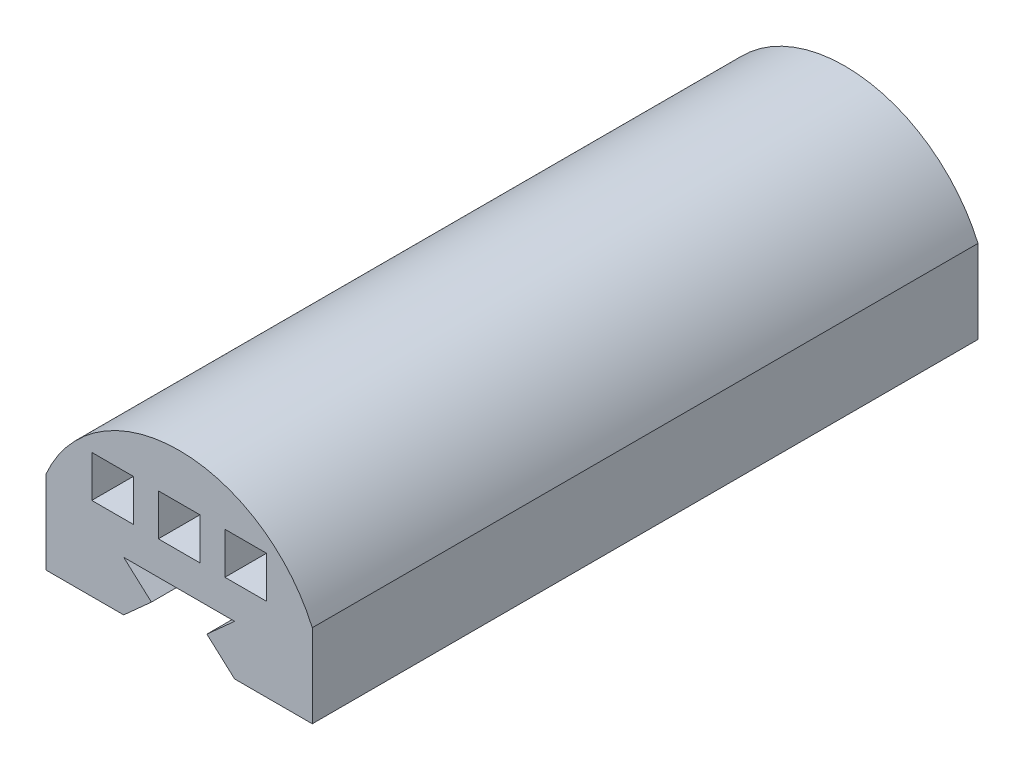
ISO-10303-21;
HEADER;
FILE_DESCRIPTION(('STEP AP214'),'2;1');
FILE_NAME('part.step','',(''),(''),'','','');
FILE_SCHEMA(('AUTOMOTIVE_DESIGN { 1 0 10303 214 1 1 1 1 }'));
ENDSEC;
DATA;
#1=APPLICATION_CONTEXT('core data for automotive mechanical design processes');
#2=APPLICATION_PROTOCOL_DEFINITION('international standard','automotive_design',2000,#1);
#3=PRODUCT_CONTEXT('',#1,'mechanical');
#4=PRODUCT('Part','Part','',(#3));
#5=PRODUCT_RELATED_PRODUCT_CATEGORY('part','',(#4));
#6=PRODUCT_DEFINITION_FORMATION('','',#4);
#7=PRODUCT_DEFINITION_CONTEXT('part definition',#1,'design');
#8=PRODUCT_DEFINITION('design','',#6,#7);
#9=PRODUCT_DEFINITION_SHAPE('','',#8);
#10=(LENGTH_UNIT() NAMED_UNIT(*) SI_UNIT(.MILLI.,.METRE.));
#11=(NAMED_UNIT(*) PLANE_ANGLE_UNIT() SI_UNIT($,.RADIAN.));
#12=(NAMED_UNIT(*) SI_UNIT($,.STERADIAN.) SOLID_ANGLE_UNIT());
#13=UNCERTAINTY_MEASURE_WITH_UNIT(LENGTH_MEASURE(1.E-05),#10,'distance_accuracy_value','');
#14=(GEOMETRIC_REPRESENTATION_CONTEXT(3) GLOBAL_UNCERTAINTY_ASSIGNED_CONTEXT((#13)) GLOBAL_UNIT_ASSIGNED_CONTEXT((#10,
#11,#12)) REPRESENTATION_CONTEXT('',''));
#15=CARTESIAN_POINT('',(0.,0.,0.));
#16=DIRECTION('',(0.,0.,1.));
#17=DIRECTION('',(1.,0.,0.));
#18=AXIS2_PLACEMENT_3D('',#15,#16,#17);
#19=CARTESIAN_POINT('',(-10.16,19.05,-25.4));
#20=DIRECTION('',(0.,0.,-1.));
#21=DIRECTION('',(-1.,0.,0.));
#22=AXIS2_PLACEMENT_3D('',#19,#20,#21);
#23=PLANE('',#22);
#24=DIRECTION('',(-1.,0.,0.));
#25=VECTOR('',#24,1.);
#26=CARTESIAN_POINT('',(-6.6675,9.525,-25.4));
#27=LINE('',#26,#25);
#28=CARTESIAN_POINT('',(-3.4925,9.525,-25.4));
#29=VERTEX_POINT('',#28);
#30=CARTESIAN_POINT('',(-6.6675,9.525,-25.4));
#31=VERTEX_POINT('',#30);
#32=EDGE_CURVE('E230',#29,#31,#27,.T.);
#33=ORIENTED_EDGE('',*,*,#32,.T.);
#34=DIRECTION('',(0.,-1.,0.));
#35=VECTOR('',#34,1.);
#36=CARTESIAN_POINT('',(-6.6675,9.525,-25.4));
#37=LINE('',#36,#35);
#38=CARTESIAN_POINT('',(-6.6675,6.35,-25.4));
#39=VERTEX_POINT('',#38);
#40=EDGE_CURVE('E250',#31,#39,#37,.T.);
#41=ORIENTED_EDGE('',*,*,#40,.T.);
#42=DIRECTION('',(1.,0.,0.));
#43=VECTOR('',#42,1.);
#44=CARTESIAN_POINT('',(-6.6675,6.35,-25.4));
#45=LINE('',#44,#43);
#46=CARTESIAN_POINT('',(-3.4925,6.35,-25.4));
#47=VERTEX_POINT('',#46);
#48=EDGE_CURVE('E246',#39,#47,#45,.T.);
#49=ORIENTED_EDGE('',*,*,#48,.T.);
#50=DIRECTION('',(0.,1.,0.));
#51=VECTOR('',#50,1.);
#52=CARTESIAN_POINT('',(-3.4925,9.525,-25.4));
#53=LINE('',#52,#51);
#54=EDGE_CURVE('E242',#47,#29,#53,.T.);
#55=ORIENTED_EDGE('',*,*,#54,.T.);
#56=EDGE_LOOP('',(#33,#41,#49,#55));
#57=FACE_BOUND('',#56,.T.);
#58=CARTESIAN_POINT('',(0.,1.905,-25.4));
#59=DIRECTION('',(0.,0.,-1.));
#60=DIRECTION('',(-1.,0.,0.));
#61=AXIS2_PLACEMENT_3D('',#58,#59,#60);
#62=CIRCLE('',#61,11.0897982398238);
#63=CARTESIAN_POINT('',(-10.16,6.35,-25.4));
#64=VERTEX_POINT('',#63);
#65=CARTESIAN_POINT('',(10.16,6.35,-25.4));
#66=VERTEX_POINT('',#65);
#67=EDGE_CURVE('E290',#64,#66,#62,.T.);
#68=ORIENTED_EDGE('',*,*,#67,.T.);
#69=DIRECTION('',(0.,-1.,0.));
#70=VECTOR('',#69,1.);
#71=CARTESIAN_POINT('',(10.16,19.05,-25.4));
#72=LINE('',#71,#70);
#73=CARTESIAN_POINT('',(10.16,0.,-25.4));
#74=VERTEX_POINT('',#73);
#75=EDGE_CURVE('E352',#66,#74,#72,.T.);
#76=ORIENTED_EDGE('',*,*,#75,.T.);
#77=DIRECTION('',(1.,0.,0.));
#78=VECTOR('',#77,1.);
#79=CARTESIAN_POINT('',(-10.16,0.,-25.4));
#80=LINE('',#79,#78);
#81=CARTESIAN_POINT('',(4.23333333333333,0.,-25.4));
#82=VERTEX_POINT('',#81);
#83=EDGE_CURVE('E339',#82,#74,#80,.T.);
#84=ORIENTED_EDGE('',*,*,#83,.F.);
#85=DIRECTION('',(-0.743294146247165,0.668964731622451,0.));
#86=VECTOR('',#85,1.);
#87=CARTESIAN_POINT('',(2.11666666666667,1.905,-25.4));
#88=LINE('',#87,#86);
#89=CARTESIAN_POINT('',(2.11666666666667,1.905,-25.4));
#90=VERTEX_POINT('',#89);
#91=EDGE_CURVE('E299',#82,#90,#88,.T.);
#92=ORIENTED_EDGE('',*,*,#91,.T.);
#93=DIRECTION('',(0.743294146247167,0.668964731622449,0.));
#94=VECTOR('',#93,1.);
#95=CARTESIAN_POINT('',(4.23333333333333,3.81,-25.4));
#96=LINE('',#95,#94);
#97=CARTESIAN_POINT('',(4.23333333333333,3.81,-25.4));
#98=VERTEX_POINT('',#97);
#99=EDGE_CURVE('E328',#90,#98,#96,.T.);
#100=ORIENTED_EDGE('',*,*,#99,.T.);
#101=DIRECTION('',(-1.,0.,0.));
#102=VECTOR('',#101,1.);
#103=CARTESIAN_POINT('',(-4.23333333333333,3.81,-25.4));
#104=LINE('',#103,#102);
#105=CARTESIAN_POINT('',(-4.23333333333333,3.81,-25.4));
#106=VERTEX_POINT('',#105);
#107=EDGE_CURVE('E324',#98,#106,#104,.T.);
#108=ORIENTED_EDGE('',*,*,#107,.T.);
#109=DIRECTION('',(0.743294146247166,-0.66896473162245,0.));
#110=VECTOR('',#109,1.);
#111=CARTESIAN_POINT('',(-2.11666666666667,1.905,-25.4));
#112=LINE('',#111,#110);
#113=CARTESIAN_POINT('',(-2.11666666666667,1.905,-25.4));
#114=VERTEX_POINT('',#113);
#115=EDGE_CURVE('E320',#106,#114,#112,.T.);
#116=ORIENTED_EDGE('',*,*,#115,.T.);
#117=DIRECTION('',(-0.743294146247166,-0.66896473162245,0.));
#118=VECTOR('',#117,1.);
#119=CARTESIAN_POINT('',(-4.23333333333333,0.,-25.4));
#120=LINE('',#119,#118);
#121=CARTESIAN_POINT('',(-4.23333333333333,0.,-25.4));
#122=VERTEX_POINT('',#121);
#123=EDGE_CURVE('E315',#114,#122,#120,.T.);
#124=ORIENTED_EDGE('',*,*,#123,.T.);
#125=CARTESIAN_POINT('',(-10.16,0.,-25.4));
#126=VERTEX_POINT('',#125);
#127=EDGE_CURVE('E340',#126,#122,#80,.T.);
#128=ORIENTED_EDGE('',*,*,#127,.F.);
#129=DIRECTION('',(0.,-1.,0.));
#130=VECTOR('',#129,1.);
#131=CARTESIAN_POINT('',(-10.16,19.05,-25.4));
#132=LINE('',#131,#130);
#133=EDGE_CURVE('E11',#64,#126,#132,.T.);
#134=ORIENTED_EDGE('',*,*,#133,.F.);
#135=EDGE_LOOP('',(#68,#76,#84,#92,#100,#108,#116,#124,#128,#134));
#136=FACE_BOUND('',#135,.T.);
#137=DIRECTION('',(-1.,0.,0.));
#138=VECTOR('',#137,1.);
#139=CARTESIAN_POINT('',(-1.5875,9.525,-25.4));
#140=LINE('',#139,#138);
#141=CARTESIAN_POINT('',(1.5875,9.525,-25.4));
#142=VERTEX_POINT('',#141);
#143=CARTESIAN_POINT('',(-1.5875,9.525,-25.4));
#144=VERTEX_POINT('',#143);
#145=EDGE_CURVE('E202',#142,#144,#140,.T.);
#146=ORIENTED_EDGE('',*,*,#145,.T.);
#147=DIRECTION('',(0.,-1.,0.));
#148=VECTOR('',#147,1.);
#149=CARTESIAN_POINT('',(-1.5875,9.525,-25.4));
#150=LINE('',#149,#148);
#151=CARTESIAN_POINT('',(-1.5875,6.35,-25.4));
#152=VERTEX_POINT('',#151);
#153=EDGE_CURVE('E188',#144,#152,#150,.T.);
#154=ORIENTED_EDGE('',*,*,#153,.T.);
#155=DIRECTION('',(1.,0.,0.));
#156=VECTOR('',#155,1.);
#157=CARTESIAN_POINT('',(-1.5875,6.35,-25.4));
#158=LINE('',#157,#156);
#159=CARTESIAN_POINT('',(1.5875,6.35,-25.4));
#160=VERTEX_POINT('',#159);
#161=EDGE_CURVE('E221',#152,#160,#158,.T.);
#162=ORIENTED_EDGE('',*,*,#161,.T.);
#163=DIRECTION('',(0.,1.,0.));
#164=VECTOR('',#163,1.);
#165=CARTESIAN_POINT('',(1.5875,9.525,-25.4));
#166=LINE('',#165,#164);
#167=EDGE_CURVE('E209',#160,#142,#166,.T.);
#168=ORIENTED_EDGE('',*,*,#167,.T.);
#169=EDGE_LOOP('',(#146,#154,#162,#168));
#170=FACE_BOUND('',#169,.T.);
#171=DIRECTION('',(-1.,0.,0.));
#172=VECTOR('',#171,1.);
#173=CARTESIAN_POINT('',(3.4925,9.525,-25.4));
#174=LINE('',#173,#172);
#175=CARTESIAN_POINT('',(6.6675,9.525,-25.4));
#176=VERTEX_POINT('',#175);
#177=CARTESIAN_POINT('',(3.4925,9.525,-25.4));
#178=VERTEX_POINT('',#177);
#179=EDGE_CURVE('E260',#176,#178,#174,.T.);
#180=ORIENTED_EDGE('',*,*,#179,.T.);
#181=DIRECTION('',(0.,-1.,0.));
#182=VECTOR('',#181,1.);
#183=CARTESIAN_POINT('',(3.4925,9.525,-25.4));
#184=LINE('',#183,#182);
#185=CARTESIAN_POINT('',(3.4925,6.35,-25.4));
#186=VERTEX_POINT('',#185);
#187=EDGE_CURVE('E280',#178,#186,#184,.T.);
#188=ORIENTED_EDGE('',*,*,#187,.T.);
#189=DIRECTION('',(1.,0.,0.));
#190=VECTOR('',#189,1.);
#191=CARTESIAN_POINT('',(3.4925,6.35,-25.4));
#192=LINE('',#191,#190);
#193=CARTESIAN_POINT('',(6.6675,6.35,-25.4));
#194=VERTEX_POINT('',#193);
#195=EDGE_CURVE('E276',#186,#194,#192,.T.);
#196=ORIENTED_EDGE('',*,*,#195,.T.);
#197=DIRECTION('',(0.,1.,0.));
#198=VECTOR('',#197,1.);
#199=CARTESIAN_POINT('',(6.6675,9.525,-25.4));
#200=LINE('',#199,#198);
#201=EDGE_CURVE('E272',#194,#176,#200,.T.);
#202=ORIENTED_EDGE('',*,*,#201,.T.);
#203=EDGE_LOOP('',(#180,#188,#196,#202));
#204=FACE_BOUND('',#203,.T.);
#205=ADVANCED_FACE('F39',(#57,#136,#170,#204),#23,.T.);
#206=CARTESIAN_POINT('',(-10.16,19.05,25.4));
#207=DIRECTION('',(0.,0.,-1.));
#208=DIRECTION('',(-1.,0.,0.));
#209=AXIS2_PLACEMENT_3D('',#206,#207,#208);
#210=PLANE('',#209);
#211=DIRECTION('',(0.,-1.,0.));
#212=VECTOR('',#211,1.);
#213=CARTESIAN_POINT('',(10.16,19.05,25.4));
#214=LINE('',#213,#212);
#215=CARTESIAN_POINT('',(10.16,6.35000000000003,25.4));
#216=VERTEX_POINT('',#215);
#217=CARTESIAN_POINT('',(10.16,0.,25.4));
#218=VERTEX_POINT('',#217);
#219=EDGE_CURVE('E355',#216,#218,#214,.T.);
#220=ORIENTED_EDGE('',*,*,#219,.F.);
#221=CARTESIAN_POINT('',(0.,1.905,25.4));
#222=DIRECTION('',(0.,0.,-1.));
#223=DIRECTION('',(-1.,0.,0.));
#224=AXIS2_PLACEMENT_3D('',#221,#222,#223);
#225=CIRCLE('',#224,11.0897982398238);
#226=CARTESIAN_POINT('',(-10.16,6.35,25.4));
#227=VERTEX_POINT('',#226);
#228=EDGE_CURVE('E227',#227,#216,#225,.T.);
#229=ORIENTED_EDGE('',*,*,#228,.F.);
#230=DIRECTION('',(0.,-1.,0.));
#231=VECTOR('',#230,1.);
#232=CARTESIAN_POINT('',(-10.16,19.05,25.4));
#233=LINE('',#232,#231);
#234=CARTESIAN_POINT('',(-10.16,0.,25.4));
#235=VERTEX_POINT('',#234);
#236=EDGE_CURVE('E47',#227,#235,#233,.T.);
#237=ORIENTED_EDGE('',*,*,#236,.T.);
#238=DIRECTION('',(1.,0.,0.));
#239=VECTOR('',#238,1.);
#240=CARTESIAN_POINT('',(-10.16,0.,25.4));
#241=LINE('',#240,#239);
#242=CARTESIAN_POINT('',(-4.23333333333333,0.,25.4));
#243=VERTEX_POINT('',#242);
#244=EDGE_CURVE('E347',#235,#243,#241,.T.);
#245=ORIENTED_EDGE('',*,*,#244,.T.);
#246=DIRECTION('',(-0.743294146247166,-0.66896473162245,0.));
#247=VECTOR('',#246,1.);
#248=CARTESIAN_POINT('',(-4.23333333333333,0.,25.4));
#249=LINE('',#248,#247);
#250=CARTESIAN_POINT('',(-2.11666666666667,1.905,25.4));
#251=VERTEX_POINT('',#250);
#252=EDGE_CURVE('E297',#251,#243,#249,.T.);
#253=ORIENTED_EDGE('',*,*,#252,.F.);
#254=DIRECTION('',(0.743294146247166,-0.66896473162245,0.));
#255=VECTOR('',#254,1.);
#256=CARTESIAN_POINT('',(-2.11666666666667,1.905,25.4));
#257=LINE('',#256,#255);
#258=CARTESIAN_POINT('',(-4.23333333333333,3.81,25.4));
#259=VERTEX_POINT('',#258);
#260=EDGE_CURVE('E300',#259,#251,#257,.T.);
#261=ORIENTED_EDGE('',*,*,#260,.F.);
#262=DIRECTION('',(-1.,0.,0.));
#263=VECTOR('',#262,1.);
#264=CARTESIAN_POINT('',(-4.23333333333333,3.81,25.4));
#265=LINE('',#264,#263);
#266=CARTESIAN_POINT('',(4.23333333333333,3.81,25.4));
#267=VERTEX_POINT('',#266);
#268=EDGE_CURVE('E303',#267,#259,#265,.T.);
#269=ORIENTED_EDGE('',*,*,#268,.F.);
#270=DIRECTION('',(0.743294146247167,0.668964731622449,0.));
#271=VECTOR('',#270,1.);
#272=CARTESIAN_POINT('',(4.23333333333333,3.81,25.4));
#273=LINE('',#272,#271);
#274=CARTESIAN_POINT('',(2.11666666666667,1.905,25.4));
#275=VERTEX_POINT('',#274);
#276=EDGE_CURVE('E306',#275,#267,#273,.T.);
#277=ORIENTED_EDGE('',*,*,#276,.F.);
#278=DIRECTION('',(-0.743294146247165,0.668964731622451,0.));
#279=VECTOR('',#278,1.);
#280=CARTESIAN_POINT('',(2.11666666666667,1.905,25.4));
#281=LINE('',#280,#279);
#282=CARTESIAN_POINT('',(4.23333333333333,0.,25.4));
#283=VERTEX_POINT('',#282);
#284=EDGE_CURVE('E309',#283,#275,#281,.T.);
#285=ORIENTED_EDGE('',*,*,#284,.F.);
#286=EDGE_CURVE('E346',#283,#218,#241,.T.);
#287=ORIENTED_EDGE('',*,*,#286,.T.);
#288=EDGE_LOOP('',(#220,#229,#237,#245,#253,#261,#269,#277,#285,#287));
#289=FACE_BOUND('',#288,.T.);
#290=DIRECTION('',(0.,-1.,0.));
#291=VECTOR('',#290,1.);
#292=CARTESIAN_POINT('',(-1.5875,9.525,25.4));
#293=LINE('',#292,#291);
#294=CARTESIAN_POINT('',(-1.5875,9.525,25.4));
#295=VERTEX_POINT('',#294);
#296=CARTESIAN_POINT('',(-1.5875,6.35,25.4));
#297=VERTEX_POINT('',#296);
#298=EDGE_CURVE('E212',#295,#297,#293,.T.);
#299=ORIENTED_EDGE('',*,*,#298,.F.);
#300=DIRECTION('',(-1.,0.,0.));
#301=VECTOR('',#300,1.);
#302=CARTESIAN_POINT('',(-1.5875,9.525,25.4));
#303=LINE('',#302,#301);
#304=CARTESIAN_POINT('',(1.5875,9.525,25.4));
#305=VERTEX_POINT('',#304);
#306=EDGE_CURVE('E205',#305,#295,#303,.T.);
#307=ORIENTED_EDGE('',*,*,#306,.F.);
#308=DIRECTION('',(0.,1.,0.));
#309=VECTOR('',#308,1.);
#310=CARTESIAN_POINT('',(1.5875,9.525,25.4));
#311=LINE('',#310,#309);
#312=CARTESIAN_POINT('',(1.5875,6.35,25.4));
#313=VERTEX_POINT('',#312);
#314=EDGE_CURVE('E216',#313,#305,#311,.T.);
#315=ORIENTED_EDGE('',*,*,#314,.F.);
#316=DIRECTION('',(1.,0.,0.));
#317=VECTOR('',#316,1.);
#318=CARTESIAN_POINT('',(-1.5875,6.35,25.4));
#319=LINE('',#318,#317);
#320=EDGE_CURVE('E210',#297,#313,#319,.T.);
#321=ORIENTED_EDGE('',*,*,#320,.F.);
#322=EDGE_LOOP('',(#299,#307,#315,#321));
#323=FACE_BOUND('',#322,.T.);
#324=DIRECTION('',(0.,-1.,0.));
#325=VECTOR('',#324,1.);
#326=CARTESIAN_POINT('',(-6.6675,9.525,25.4));
#327=LINE('',#326,#325);
#328=CARTESIAN_POINT('',(-6.6675,9.525,25.4));
#329=VERTEX_POINT('',#328);
#330=CARTESIAN_POINT('',(-6.6675,6.35,25.4));
#331=VERTEX_POINT('',#330);
#332=EDGE_CURVE('E231',#329,#331,#327,.T.);
#333=ORIENTED_EDGE('',*,*,#332,.F.);
#334=DIRECTION('',(-1.,0.,0.));
#335=VECTOR('',#334,1.);
#336=CARTESIAN_POINT('',(-6.6675,9.525,25.4));
#337=LINE('',#336,#335);
#338=CARTESIAN_POINT('',(-3.4925,9.525,25.4));
#339=VERTEX_POINT('',#338);
#340=EDGE_CURVE('E234',#339,#329,#337,.T.);
#341=ORIENTED_EDGE('',*,*,#340,.F.);
#342=DIRECTION('',(0.,1.,0.));
#343=VECTOR('',#342,1.);
#344=CARTESIAN_POINT('',(-3.4925,9.525,25.4));
#345=LINE('',#344,#343);
#346=CARTESIAN_POINT('',(-3.4925,6.35,25.4));
#347=VERTEX_POINT('',#346);
#348=EDGE_CURVE('E237',#347,#339,#345,.T.);
#349=ORIENTED_EDGE('',*,*,#348,.F.);
#350=DIRECTION('',(1.,0.,0.));
#351=VECTOR('',#350,1.);
#352=CARTESIAN_POINT('',(-6.6675,6.35,25.4));
#353=LINE('',#352,#351);
#354=EDGE_CURVE('E228',#331,#347,#353,.T.);
#355=ORIENTED_EDGE('',*,*,#354,.F.);
#356=EDGE_LOOP('',(#333,#341,#349,#355));
#357=FACE_BOUND('',#356,.T.);
#358=DIRECTION('',(0.,-1.,0.));
#359=VECTOR('',#358,1.);
#360=CARTESIAN_POINT('',(3.4925,9.525,25.4));
#361=LINE('',#360,#359);
#362=CARTESIAN_POINT('',(3.4925,9.525,25.4));
#363=VERTEX_POINT('',#362);
#364=CARTESIAN_POINT('',(3.4925,6.35,25.4));
#365=VERTEX_POINT('',#364);
#366=EDGE_CURVE('E261',#363,#365,#361,.T.);
#367=ORIENTED_EDGE('',*,*,#366,.F.);
#368=DIRECTION('',(-1.,0.,0.));
#369=VECTOR('',#368,1.);
#370=CARTESIAN_POINT('',(3.4925,9.525,25.4));
#371=LINE('',#370,#369);
#372=CARTESIAN_POINT('',(6.6675,9.525,25.4));
#373=VERTEX_POINT('',#372);
#374=EDGE_CURVE('E264',#373,#363,#371,.T.);
#375=ORIENTED_EDGE('',*,*,#374,.F.);
#376=DIRECTION('',(0.,1.,0.));
#377=VECTOR('',#376,1.);
#378=CARTESIAN_POINT('',(6.6675,9.525,25.4));
#379=LINE('',#378,#377);
#380=CARTESIAN_POINT('',(6.6675,6.35,25.4));
#381=VERTEX_POINT('',#380);
#382=EDGE_CURVE('E267',#381,#373,#379,.T.);
#383=ORIENTED_EDGE('',*,*,#382,.F.);
#384=DIRECTION('',(1.,0.,0.));
#385=VECTOR('',#384,1.);
#386=CARTESIAN_POINT('',(3.4925,6.35,25.4));
#387=LINE('',#386,#385);
#388=EDGE_CURVE('E258',#365,#381,#387,.T.);
#389=ORIENTED_EDGE('',*,*,#388,.F.);
#390=EDGE_LOOP('',(#367,#375,#383,#389));
#391=FACE_BOUND('',#390,.T.);
#392=ADVANCED_FACE('F373',(#289,#323,#357,#391),#210,.F.);
#393=CARTESIAN_POINT('',(0.,0.,0.));
#394=DIRECTION('',(0.,-1.,0.));
#395=DIRECTION('',(0.,0.,-1.));
#396=AXIS2_PLACEMENT_3D('',#393,#394,#395);
#397=PLANE('',#396);
#398=DIRECTION('',(0.,0.,1.));
#399=VECTOR('',#398,1.);
#400=CARTESIAN_POINT('',(4.23333333333333,0.,-34.6844248311053));
#401=LINE('',#400,#399);
#402=EDGE_CURVE('E333',#82,#283,#401,.T.);
#403=ORIENTED_EDGE('',*,*,#402,.F.);
#404=ORIENTED_EDGE('',*,*,#83,.T.);
#405=DIRECTION('',(0.,0.,1.));
#406=VECTOR('',#405,1.);
#407=CARTESIAN_POINT('',(10.16,0.,-25.4));
#408=LINE('',#407,#406);
#409=EDGE_CURVE('E343',#74,#218,#408,.T.);
#410=ORIENTED_EDGE('',*,*,#409,.T.);
#411=ORIENTED_EDGE('',*,*,#286,.F.);
#412=EDGE_LOOP('',(#403,#404,#410,#411));
#413=FACE_BOUND('',#412,.T.);
#414=ADVANCED_FACE('F365',(#413),#397,.T.);
#415=CARTESIAN_POINT('',(-10.16,19.05,-25.4));
#416=DIRECTION('',(1.,0.,0.));
#417=DIRECTION('',(0.,0.,-1.));
#418=AXIS2_PLACEMENT_3D('',#415,#416,#417);
#419=PLANE('',#418);
#420=ORIENTED_EDGE('',*,*,#236,.F.);
#421=DIRECTION('',(0.,0.,1.));
#422=VECTOR('',#421,1.);
#423=CARTESIAN_POINT('',(-10.16,6.35,-49.3623120754238));
#424=LINE('',#423,#422);
#425=EDGE_CURVE('E289',#64,#227,#424,.T.);
#426=ORIENTED_EDGE('',*,*,#425,.F.);
#427=ORIENTED_EDGE('',*,*,#133,.T.);
#428=DIRECTION('',(0.,0.,1.));
#429=VECTOR('',#428,1.);
#430=CARTESIAN_POINT('',(-10.16,0.,-25.4));
#431=LINE('',#430,#429);
#432=EDGE_CURVE('E350',#126,#235,#431,.T.);
#433=ORIENTED_EDGE('',*,*,#432,.T.);
#434=EDGE_LOOP('',(#420,#426,#427,#433));
#435=FACE_BOUND('',#434,.T.);
#436=ADVANCED_FACE('F399',(#435),#419,.F.);
#437=CARTESIAN_POINT('',(10.16,19.05,-25.4));
#438=DIRECTION('',(1.,0.,0.));
#439=DIRECTION('',(0.,0.,-1.));
#440=AXIS2_PLACEMENT_3D('',#437,#438,#439);
#441=PLANE('',#440);
#442=DIRECTION('',(0.,0.,1.));
#443=VECTOR('',#442,1.);
#444=CARTESIAN_POINT('',(10.16,6.35,-49.3623120754238));
#445=LINE('',#444,#443);
#446=EDGE_CURVE('E293',#66,#216,#445,.T.);
#447=ORIENTED_EDGE('',*,*,#446,.T.);
#448=ORIENTED_EDGE('',*,*,#219,.T.);
#449=ORIENTED_EDGE('',*,*,#409,.F.);
#450=ORIENTED_EDGE('',*,*,#75,.F.);
#451=EDGE_LOOP('',(#447,#448,#449,#450));
#452=FACE_BOUND('',#451,.T.);
#453=ADVANCED_FACE('F367',(#452),#441,.T.);
#454=DIRECTION('',(0.,0.,1.));
#455=VECTOR('',#454,1.);
#456=CARTESIAN_POINT('',(-4.23333333333333,0.,-34.6844248311053));
#457=LINE('',#456,#455);
#458=EDGE_CURVE('E318',#122,#243,#457,.T.);
#459=ORIENTED_EDGE('',*,*,#458,.T.);
#460=ORIENTED_EDGE('',*,*,#244,.F.);
#461=ORIENTED_EDGE('',*,*,#432,.F.);
#462=ORIENTED_EDGE('',*,*,#127,.T.);
#463=EDGE_LOOP('',(#459,#460,#461,#462));
#464=FACE_BOUND('',#463,.T.);
#465=ADVANCED_FACE('F395',(#464),#397,.T.);
#466=CARTESIAN_POINT('',(2.11666666666667,1.905,-34.6844248311053));
#467=DIRECTION('',(0.668964731622451,0.743294146247166,0.));
#468=DIRECTION('',(-0.743294146247166,0.668964731622451,0.));
#469=AXIS2_PLACEMENT_3D('',#466,#467,#468);
#470=PLANE('',#469);
#471=ORIENTED_EDGE('',*,*,#402,.T.);
#472=ORIENTED_EDGE('',*,*,#284,.T.);
#473=DIRECTION('',(0.,0.,1.));
#474=VECTOR('',#473,1.);
#475=CARTESIAN_POINT('',(2.11666666666667,1.905,-34.6844248311053));
#476=LINE('',#475,#474);
#477=EDGE_CURVE('E314',#90,#275,#476,.T.);
#478=ORIENTED_EDGE('',*,*,#477,.F.);
#479=ORIENTED_EDGE('',*,*,#91,.F.);
#480=EDGE_LOOP('',(#471,#472,#478,#479));
#481=FACE_BOUND('',#480,.T.);
#482=ADVANCED_FACE('F379',(#481),#470,.F.);
#483=CARTESIAN_POINT('',(4.23333333333333,3.81,-34.6844248311053));
#484=DIRECTION('',(0.668964731622449,-0.743294146247167,0.));
#485=DIRECTION('',(0.743294146247167,0.668964731622449,0.));
#486=AXIS2_PLACEMENT_3D('',#483,#484,#485);
#487=PLANE('',#486);
#488=ORIENTED_EDGE('',*,*,#477,.T.);
#489=ORIENTED_EDGE('',*,*,#276,.T.);
#490=DIRECTION('',(0.,0.,1.));
#491=VECTOR('',#490,1.);
#492=CARTESIAN_POINT('',(4.23333333333333,3.81,-34.6844248311053));
#493=LINE('',#492,#491);
#494=EDGE_CURVE('E327',#98,#267,#493,.T.);
#495=ORIENTED_EDGE('',*,*,#494,.F.);
#496=ORIENTED_EDGE('',*,*,#99,.F.);
#497=EDGE_LOOP('',(#488,#489,#495,#496));
#498=FACE_BOUND('',#497,.T.);
#499=ADVANCED_FACE('F382',(#498),#487,.F.);
#500=CARTESIAN_POINT('',(-4.23333333333333,3.81,-34.6844248311053));
#501=DIRECTION('',(0.,1.,0.));
#502=DIRECTION('',(0.,0.,1.));
#503=AXIS2_PLACEMENT_3D('',#500,#501,#502);
#504=PLANE('',#503);
#505=CARTESIAN_POINT('',(0.,3.81,4.10634179999999));
#506=DIRECTION('',(0.,1.,0.));
#507=DIRECTION('',(0.,0.,1.));
#508=AXIS2_PLACEMENT_3D('',#505,#506,#507);
#509=CIRCLE('',#508,0.635);
#510=CARTESIAN_POINT('',(0.,3.81,4.74134179999999));
#511=VERTEX_POINT('',#510);
#512=EDGE_CURVE('E42',#511,#511,#509,.T.);
#513=ORIENTED_EDGE('',*,*,#512,.T.);
#514=EDGE_LOOP('',(#513));
#515=FACE_BOUND('',#514,.T.);
#516=ORIENTED_EDGE('',*,*,#494,.T.);
#517=ORIENTED_EDGE('',*,*,#268,.T.);
#518=DIRECTION('',(0.,0.,1.));
#519=VECTOR('',#518,1.);
#520=CARTESIAN_POINT('',(-4.23333333333333,3.81,-34.6844248311053));
#521=LINE('',#520,#519);
#522=EDGE_CURVE('E323',#106,#259,#521,.T.);
#523=ORIENTED_EDGE('',*,*,#522,.F.);
#524=ORIENTED_EDGE('',*,*,#107,.F.);
#525=EDGE_LOOP('',(#516,#517,#523,#524));
#526=FACE_BOUND('',#525,.T.);
#527=ADVANCED_FACE('F384',(#515,#526),#504,.F.);
#528=CARTESIAN_POINT('',(-2.11666666666667,1.905,-34.6844248311053));
#529=DIRECTION('',(-0.66896473162245,-0.743294146247166,0.));
#530=DIRECTION('',(0.743294146247166,-0.66896473162245,0.));
#531=AXIS2_PLACEMENT_3D('',#528,#529,#530);
#532=PLANE('',#531);
#533=ORIENTED_EDGE('',*,*,#522,.T.);
#534=ORIENTED_EDGE('',*,*,#260,.T.);
#535=DIRECTION('',(0.,0.,1.));
#536=VECTOR('',#535,1.);
#537=CARTESIAN_POINT('',(-2.11666666666667,1.905,-34.6844248311053));
#538=LINE('',#537,#536);
#539=EDGE_CURVE('E319',#114,#251,#538,.T.);
#540=ORIENTED_EDGE('',*,*,#539,.F.);
#541=ORIENTED_EDGE('',*,*,#115,.F.);
#542=EDGE_LOOP('',(#533,#534,#540,#541));
#543=FACE_BOUND('',#542,.T.);
#544=ADVANCED_FACE('F388',(#543),#532,.F.);
#545=CARTESIAN_POINT('',(-4.23333333333333,0.,-34.6844248311053));
#546=DIRECTION('',(-0.66896473162245,0.743294146247166,0.));
#547=DIRECTION('',(-0.743294146247166,-0.66896473162245,0.));
#548=AXIS2_PLACEMENT_3D('',#545,#546,#547);
#549=PLANE('',#548);
#550=ORIENTED_EDGE('',*,*,#539,.T.);
#551=ORIENTED_EDGE('',*,*,#252,.T.);
#552=ORIENTED_EDGE('',*,*,#458,.F.);
#553=ORIENTED_EDGE('',*,*,#123,.F.);
#554=EDGE_LOOP('',(#550,#551,#552,#553));
#555=FACE_BOUND('',#554,.T.);
#556=ADVANCED_FACE('F403',(#555),#549,.F.);
#557=CARTESIAN_POINT('',(0.,3.81,4.10634179999999));
#558=DIRECTION('',(0.,0.,-1.));
#559=DIRECTION('',(-1.,0.,0.));
#560=AXIS2_PLACEMENT_3D('',#557,#558,#559);
#561=SPHERICAL_SURFACE('',#560,0.635);
#562=CARTESIAN_POINT('',(0.,3.81,4.10634179999999));
#563=DIRECTION('',(0.,1.,0.));
#564=DIRECTION('',(0.,0.,1.));
#565=AXIS2_PLACEMENT_3D('',#562,#563,#564);
#566=SPHERICAL_SURFACE('',#565,0.635);
#567=ORIENTED_EDGE('',*,*,#512,.F.);
#568=EDGE_LOOP('',(#567));
#569=FACE_BOUND('',#568,.T.);
#570=ADVANCED_FACE('F405',(#569),#566,.T.);
#571=CARTESIAN_POINT('',(0.,1.905,-49.3623120754238));
#572=DIRECTION('',(0.,0.,1.));
#573=DIRECTION('',(1.,0.,0.));
#574=AXIS2_PLACEMENT_3D('',#571,#572,#573);
#575=CYLINDRICAL_SURFACE('',#574,11.0897982398238);
#576=ORIENTED_EDGE('',*,*,#425,.T.);
#577=ORIENTED_EDGE('',*,*,#228,.T.);
#578=ORIENTED_EDGE('',*,*,#446,.F.);
#579=ORIENTED_EDGE('',*,*,#67,.F.);
#580=EDGE_LOOP('',(#576,#577,#578,#579));
#581=FACE_BOUND('',#580,.T.);
#582=ADVANCED_FACE('F402',(#581),#575,.T.);
#583=CARTESIAN_POINT('',(-1.5875,9.525,-49.3623120754238));
#584=DIRECTION('',(0.,1.,0.));
#585=DIRECTION('',(0.,0.,1.));
#586=AXIS2_PLACEMENT_3D('',#583,#584,#585);
#587=PLANE('',#586);
#588=DIRECTION('',(0.,0.,1.));
#589=VECTOR('',#588,1.);
#590=CARTESIAN_POINT('',(1.5875,9.525,-49.3623120754238));
#591=LINE('',#590,#589);
#592=EDGE_CURVE('E219',#142,#305,#591,.T.);
#593=ORIENTED_EDGE('',*,*,#592,.T.);
#594=ORIENTED_EDGE('',*,*,#306,.T.);
#595=DIRECTION('',(0.,0.,1.));
#596=VECTOR('',#595,1.);
#597=CARTESIAN_POINT('',(-1.5875,9.525,-49.3623120754238));
#598=LINE('',#597,#596);
#599=EDGE_CURVE('E192',#144,#295,#598,.T.);
#600=ORIENTED_EDGE('',*,*,#599,.F.);
#601=ORIENTED_EDGE('',*,*,#145,.F.);
#602=EDGE_LOOP('',(#593,#594,#600,#601));
#603=FACE_BOUND('',#602,.T.);
#604=ADVANCED_FACE('F201',(#603),#587,.F.);
#605=CARTESIAN_POINT('',(-1.5875,9.525,-49.3623120754238));
#606=DIRECTION('',(-1.,0.,0.));
#607=DIRECTION('',(0.,-1.,0.));
#608=AXIS2_PLACEMENT_3D('',#605,#606,#607);
#609=PLANE('',#608);
#610=ORIENTED_EDGE('',*,*,#599,.T.);
#611=ORIENTED_EDGE('',*,*,#298,.T.);
#612=DIRECTION('',(0.,0.,1.));
#613=VECTOR('',#612,1.);
#614=CARTESIAN_POINT('',(-1.5875,6.35,-49.3623120754238));
#615=LINE('',#614,#613);
#616=EDGE_CURVE('E194',#152,#297,#615,.T.);
#617=ORIENTED_EDGE('',*,*,#616,.F.);
#618=ORIENTED_EDGE('',*,*,#153,.F.);
#619=EDGE_LOOP('',(#610,#611,#617,#618));
#620=FACE_BOUND('',#619,.T.);
#621=ADVANCED_FACE('F190',(#620),#609,.F.);
#622=CARTESIAN_POINT('',(-1.5875,6.35,-49.3623120754238));
#623=DIRECTION('',(0.,-1.,0.));
#624=DIRECTION('',(0.,0.,-1.));
#625=AXIS2_PLACEMENT_3D('',#622,#623,#624);
#626=PLANE('',#625);
#627=ORIENTED_EDGE('',*,*,#616,.T.);
#628=ORIENTED_EDGE('',*,*,#320,.T.);
#629=DIRECTION('',(0.,0.,1.));
#630=VECTOR('',#629,1.);
#631=CARTESIAN_POINT('',(1.5875,6.35,-49.3623120754238));
#632=LINE('',#631,#630);
#633=EDGE_CURVE('E220',#160,#313,#632,.T.);
#634=ORIENTED_EDGE('',*,*,#633,.F.);
#635=ORIENTED_EDGE('',*,*,#161,.F.);
#636=EDGE_LOOP('',(#627,#628,#634,#635));
#637=FACE_BOUND('',#636,.T.);
#638=ADVANCED_FACE('F470',(#637),#626,.F.);
#639=CARTESIAN_POINT('',(1.5875,9.525,-49.3623120754238));
#640=DIRECTION('',(1.,0.,0.));
#641=DIRECTION('',(0.,1.,0.));
#642=AXIS2_PLACEMENT_3D('',#639,#640,#641);
#643=PLANE('',#642);
#644=ORIENTED_EDGE('',*,*,#633,.T.);
#645=ORIENTED_EDGE('',*,*,#314,.T.);
#646=ORIENTED_EDGE('',*,*,#592,.F.);
#647=ORIENTED_EDGE('',*,*,#167,.F.);
#648=EDGE_LOOP('',(#644,#645,#646,#647));
#649=FACE_BOUND('',#648,.T.);
#650=ADVANCED_FACE('F480',(#649),#643,.F.);
#651=CARTESIAN_POINT('',(-6.6675,9.525,-49.3623120754238));
#652=DIRECTION('',(0.,1.,0.));
#653=DIRECTION('',(0.,0.,1.));
#654=AXIS2_PLACEMENT_3D('',#651,#652,#653);
#655=PLANE('',#654);
#656=DIRECTION('',(0.,0.,1.));
#657=VECTOR('',#656,1.);
#658=CARTESIAN_POINT('',(-3.4925,9.525,-49.3623120754238));
#659=LINE('',#658,#657);
#660=EDGE_CURVE('E63',#29,#339,#659,.T.);
#661=ORIENTED_EDGE('',*,*,#660,.T.);
#662=ORIENTED_EDGE('',*,*,#340,.T.);
#663=DIRECTION('',(0.,0.,1.));
#664=VECTOR('',#663,1.);
#665=CARTESIAN_POINT('',(-6.6675,9.525,-49.3623120754238));
#666=LINE('',#665,#664);
#667=EDGE_CURVE('E241',#31,#329,#666,.T.);
#668=ORIENTED_EDGE('',*,*,#667,.F.);
#669=ORIENTED_EDGE('',*,*,#32,.F.);
#670=EDGE_LOOP('',(#661,#662,#668,#669));
#671=FACE_BOUND('',#670,.T.);
#672=ADVANCED_FACE('F422',(#671),#655,.F.);
#673=CARTESIAN_POINT('',(-6.6675,9.525,-49.3623120754238));
#674=DIRECTION('',(-1.,0.,0.));
#675=DIRECTION('',(0.,0.,1.));
#676=AXIS2_PLACEMENT_3D('',#673,#674,#675);
#677=PLANE('',#676);
#678=ORIENTED_EDGE('',*,*,#667,.T.);
#679=ORIENTED_EDGE('',*,*,#332,.T.);
#680=DIRECTION('',(0.,0.,1.));
#681=VECTOR('',#680,1.);
#682=CARTESIAN_POINT('',(-6.6675,6.35,-49.3623120754238));
#683=LINE('',#682,#681);
#684=EDGE_CURVE('E249',#39,#331,#683,.T.);
#685=ORIENTED_EDGE('',*,*,#684,.F.);
#686=ORIENTED_EDGE('',*,*,#40,.F.);
#687=EDGE_LOOP('',(#678,#679,#685,#686));
#688=FACE_BOUND('',#687,.T.);
#689=ADVANCED_FACE('F426',(#688),#677,.F.);
#690=CARTESIAN_POINT('',(-6.6675,6.35,-49.3623120754238));
#691=DIRECTION('',(0.,-1.,0.));
#692=DIRECTION('',(0.,0.,-1.));
#693=AXIS2_PLACEMENT_3D('',#690,#691,#692);
#694=PLANE('',#693);
#695=ORIENTED_EDGE('',*,*,#684,.T.);
#696=ORIENTED_EDGE('',*,*,#354,.T.);
#697=DIRECTION('',(0.,0.,1.));
#698=VECTOR('',#697,1.);
#699=CARTESIAN_POINT('',(-3.4925,6.35,-49.3623120754238));
#700=LINE('',#699,#698);
#701=EDGE_CURVE('E245',#47,#347,#700,.T.);
#702=ORIENTED_EDGE('',*,*,#701,.F.);
#703=ORIENTED_EDGE('',*,*,#48,.F.);
#704=EDGE_LOOP('',(#695,#696,#702,#703));
#705=FACE_BOUND('',#704,.T.);
#706=ADVANCED_FACE('F430',(#705),#694,.F.);
#707=CARTESIAN_POINT('',(-3.4925,9.525,-49.3623120754238));
#708=DIRECTION('',(1.,0.,0.));
#709=DIRECTION('',(0.,1.,0.));
#710=AXIS2_PLACEMENT_3D('',#707,#708,#709);
#711=PLANE('',#710);
#712=ORIENTED_EDGE('',*,*,#701,.T.);
#713=ORIENTED_EDGE('',*,*,#348,.T.);
#714=ORIENTED_EDGE('',*,*,#660,.F.);
#715=ORIENTED_EDGE('',*,*,#54,.F.);
#716=EDGE_LOOP('',(#712,#713,#714,#715));
#717=FACE_BOUND('',#716,.T.);
#718=ADVANCED_FACE('F433',(#717),#711,.F.);
#719=CARTESIAN_POINT('',(3.4925,9.525,-49.3623120754238));
#720=DIRECTION('',(0.,1.,0.));
#721=DIRECTION('',(0.,0.,1.));
#722=AXIS2_PLACEMENT_3D('',#719,#720,#721);
#723=PLANE('',#722);
#724=DIRECTION('',(0.,0.,1.));
#725=VECTOR('',#724,1.);
#726=CARTESIAN_POINT('',(6.6675,9.525,-49.3623120754238));
#727=LINE('',#726,#725);
#728=EDGE_CURVE('E55',#176,#373,#727,.T.);
#729=ORIENTED_EDGE('',*,*,#728,.T.);
#730=ORIENTED_EDGE('',*,*,#374,.T.);
#731=DIRECTION('',(0.,0.,1.));
#732=VECTOR('',#731,1.);
#733=CARTESIAN_POINT('',(3.4925,9.525,-49.3623120754238));
#734=LINE('',#733,#732);
#735=EDGE_CURVE('E271',#178,#363,#734,.T.);
#736=ORIENTED_EDGE('',*,*,#735,.F.);
#737=ORIENTED_EDGE('',*,*,#179,.F.);
#738=EDGE_LOOP('',(#729,#730,#736,#737));
#739=FACE_BOUND('',#738,.T.);
#740=ADVANCED_FACE('F445',(#739),#723,.F.);
#741=CARTESIAN_POINT('',(3.4925,9.525,-49.3623120754238));
#742=DIRECTION('',(-1.,0.,0.));
#743=DIRECTION('',(0.,-1.,0.));
#744=AXIS2_PLACEMENT_3D('',#741,#742,#743);
#745=PLANE('',#744);
#746=ORIENTED_EDGE('',*,*,#735,.T.);
#747=ORIENTED_EDGE('',*,*,#366,.T.);
#748=DIRECTION('',(0.,0.,1.));
#749=VECTOR('',#748,1.);
#750=CARTESIAN_POINT('',(3.4925,6.35,-49.3623120754238));
#751=LINE('',#750,#749);
#752=EDGE_CURVE('E279',#186,#365,#751,.T.);
#753=ORIENTED_EDGE('',*,*,#752,.F.);
#754=ORIENTED_EDGE('',*,*,#187,.F.);
#755=EDGE_LOOP('',(#746,#747,#753,#754));
#756=FACE_BOUND('',#755,.T.);
#757=ADVANCED_FACE('F442',(#756),#745,.F.);
#758=CARTESIAN_POINT('',(3.4925,6.35,-49.3623120754238));
#759=DIRECTION('',(0.,-1.,0.));
#760=DIRECTION('',(0.,0.,-1.));
#761=AXIS2_PLACEMENT_3D('',#758,#759,#760);
#762=PLANE('',#761);
#763=ORIENTED_EDGE('',*,*,#752,.T.);
#764=ORIENTED_EDGE('',*,*,#388,.T.);
#765=DIRECTION('',(0.,0.,1.));
#766=VECTOR('',#765,1.);
#767=CARTESIAN_POINT('',(6.6675,6.35,-49.3623120754238));
#768=LINE('',#767,#766);
#769=EDGE_CURVE('E275',#194,#381,#768,.T.);
#770=ORIENTED_EDGE('',*,*,#769,.F.);
#771=ORIENTED_EDGE('',*,*,#195,.F.);
#772=EDGE_LOOP('',(#763,#764,#770,#771));
#773=FACE_BOUND('',#772,.T.);
#774=ADVANCED_FACE('F449',(#773),#762,.F.);
#775=CARTESIAN_POINT('',(6.6675,9.525,-49.3623120754238));
#776=DIRECTION('',(1.,0.,0.));
#777=DIRECTION('',(0.,0.,-1.));
#778=AXIS2_PLACEMENT_3D('',#775,#776,#777);
#779=PLANE('',#778);
#780=ORIENTED_EDGE('',*,*,#769,.T.);
#781=ORIENTED_EDGE('',*,*,#382,.T.);
#782=ORIENTED_EDGE('',*,*,#728,.F.);
#783=ORIENTED_EDGE('',*,*,#201,.F.);
#784=EDGE_LOOP('',(#780,#781,#782,#783));
#785=FACE_BOUND('',#784,.T.);
#786=ADVANCED_FACE('F446',(#785),#779,.F.);
#787=CLOSED_SHELL('',(#205,#392,#414,#436,#453,#465,#482,#499,#527,#544,#556,#570,#582,#604,
#621,#638,#650,#672,#689,#706,#718,#740,#757,#774,#786));
#788=MANIFOLD_SOLID_BREP('B2',#787);
#789=ADVANCED_BREP_SHAPE_REPRESENTATION('',(#18,#788),#14);
#790=SHAPE_DEFINITION_REPRESENTATION(#9,#789);
ENDSEC;
END-ISO-10303-21;
